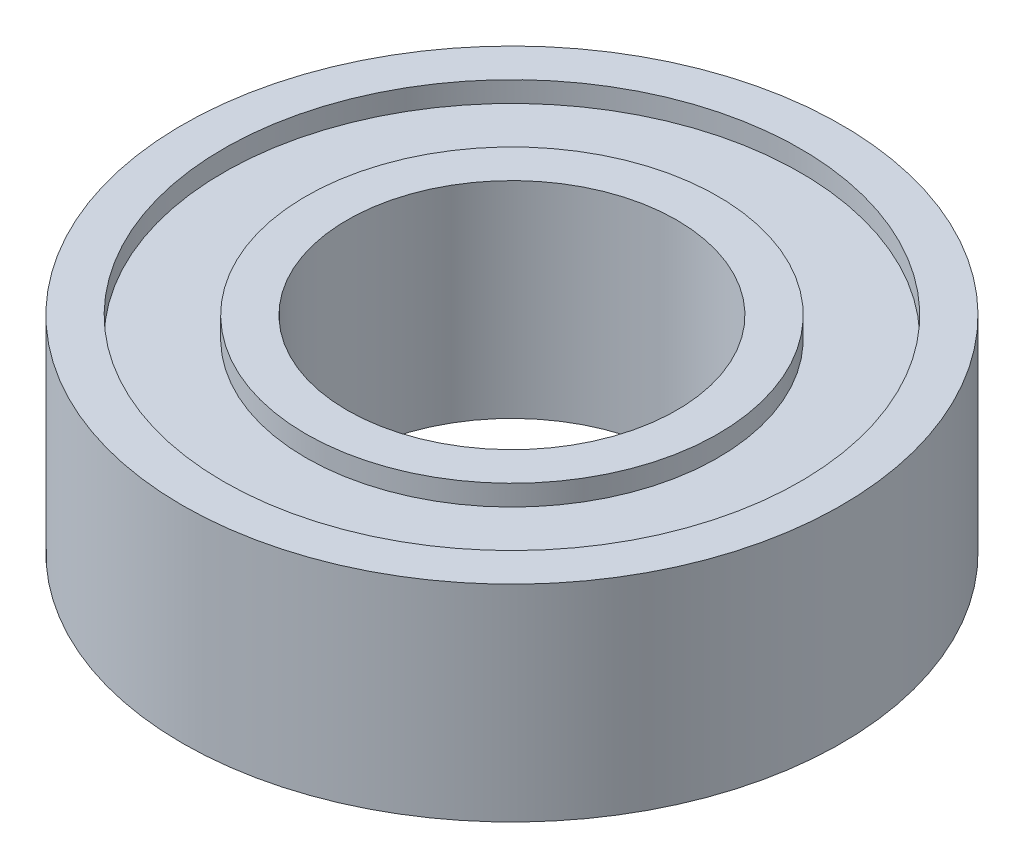
ISO-10303-21;
HEADER;
FILE_DESCRIPTION(('STEP AP214'),'2;1');
FILE_NAME('part.step','',(''),(''),'','','');
FILE_SCHEMA(('AUTOMOTIVE_DESIGN { 1 0 10303 214 1 1 1 1 }'));
ENDSEC;
DATA;
#1=APPLICATION_CONTEXT('core data for automotive mechanical design processes');
#2=APPLICATION_PROTOCOL_DEFINITION('international standard','automotive_design',2000,#1);
#3=PRODUCT_CONTEXT('',#1,'mechanical');
#4=PRODUCT('Part','Part','',(#3));
#5=PRODUCT_RELATED_PRODUCT_CATEGORY('part','',(#4));
#6=PRODUCT_DEFINITION_FORMATION('','',#4);
#7=PRODUCT_DEFINITION_CONTEXT('part definition',#1,'design');
#8=PRODUCT_DEFINITION('design','',#6,#7);
#9=PRODUCT_DEFINITION_SHAPE('','',#8);
#10=(LENGTH_UNIT() NAMED_UNIT(*) SI_UNIT(.MILLI.,.METRE.));
#11=(NAMED_UNIT(*) PLANE_ANGLE_UNIT() SI_UNIT($,.RADIAN.));
#12=(NAMED_UNIT(*) SI_UNIT($,.STERADIAN.) SOLID_ANGLE_UNIT());
#13=UNCERTAINTY_MEASURE_WITH_UNIT(LENGTH_MEASURE(1.E-05),#10,'distance_accuracy_value','');
#14=(GEOMETRIC_REPRESENTATION_CONTEXT(3) GLOBAL_UNCERTAINTY_ASSIGNED_CONTEXT((#13)) GLOBAL_UNIT_ASSIGNED_CONTEXT((#10,
#11,#12)) REPRESENTATION_CONTEXT('',''));
#15=CARTESIAN_POINT('',(0.,0.,0.));
#16=DIRECTION('',(0.,0.,1.));
#17=DIRECTION('',(1.,0.,0.));
#18=AXIS2_PLACEMENT_3D('',#15,#16,#17);
#19=CARTESIAN_POINT('',(0.,-2.5,0.));
#20=DIRECTION('',(0.,1.,0.));
#21=DIRECTION('',(0.,0.,1.));
#22=AXIS2_PLACEMENT_3D('',#19,#20,#21);
#23=PLANE('',#22);
#24=CARTESIAN_POINT('',(0.,-2.5,0.));
#25=DIRECTION('',(0.,1.,0.));
#26=DIRECTION('',(0.,0.,1.));
#27=AXIS2_PLACEMENT_3D('',#24,#25,#26);
#28=CIRCLE('',#27,4.);
#29=CARTESIAN_POINT('',(0.,-2.5,4.));
#30=VERTEX_POINT('',#29);
#31=EDGE_CURVE('E58',#30,#30,#28,.T.);
#32=ORIENTED_EDGE('',*,*,#31,.T.);
#33=EDGE_LOOP('',(#32));
#34=FACE_BOUND('',#33,.T.);
#35=CARTESIAN_POINT('',(0.,-2.5,0.));
#36=DIRECTION('',(0.,1.,0.));
#37=DIRECTION('',(0.,0.,1.));
#38=AXIS2_PLACEMENT_3D('',#35,#36,#37);
#39=CIRCLE('',#38,5.);
#40=CARTESIAN_POINT('',(0.,-2.5,5.));
#41=VERTEX_POINT('',#40);
#42=EDGE_CURVE('E82',#41,#41,#39,.T.);
#43=ORIENTED_EDGE('',*,*,#42,.F.);
#44=EDGE_LOOP('',(#43));
#45=FACE_BOUND('',#44,.T.);
#46=ADVANCED_FACE('F45',(#34,#45),#23,.F.);
#47=CARTESIAN_POINT('',(0.,2.5,0.));
#48=DIRECTION('',(0.,1.,0.));
#49=DIRECTION('',(0.,0.,1.));
#50=AXIS2_PLACEMENT_3D('',#47,#48,#49);
#51=PLANE('',#50);
#52=CARTESIAN_POINT('',(0.,2.5,0.));
#53=DIRECTION('',(0.,1.,0.));
#54=DIRECTION('',(0.,0.,1.));
#55=AXIS2_PLACEMENT_3D('',#52,#53,#54);
#56=CIRCLE('',#55,4.);
#57=CARTESIAN_POINT('',(0.,2.5,4.));
#58=VERTEX_POINT('',#57);
#59=EDGE_CURVE('E56',#58,#58,#56,.T.);
#60=ORIENTED_EDGE('',*,*,#59,.F.);
#61=EDGE_LOOP('',(#60));
#62=FACE_BOUND('',#61,.T.);
#63=CARTESIAN_POINT('',(0.,2.5,0.));
#64=DIRECTION('',(0.,1.,0.));
#65=DIRECTION('',(0.,0.,1.));
#66=AXIS2_PLACEMENT_3D('',#63,#64,#65);
#67=CIRCLE('',#66,5.);
#68=CARTESIAN_POINT('',(0.,2.5,5.));
#69=VERTEX_POINT('',#68);
#70=EDGE_CURVE('E70',#69,#69,#67,.T.);
#71=ORIENTED_EDGE('',*,*,#70,.T.);
#72=EDGE_LOOP('',(#71));
#73=FACE_BOUND('',#72,.T.);
#74=ADVANCED_FACE('F98',(#62,#73),#51,.T.);
#75=CARTESIAN_POINT('',(0.,2.5,0.));
#76=DIRECTION('',(0.,1.,0.));
#77=DIRECTION('',(0.,0.,1.));
#78=AXIS2_PLACEMENT_3D('',#75,#76,#77);
#79=CIRCLE('',#78,7.);
#80=CARTESIAN_POINT('',(0.,2.5,7.));
#81=VERTEX_POINT('',#80);
#82=EDGE_CURVE('E64',#81,#81,#79,.T.);
#83=ORIENTED_EDGE('',*,*,#82,.F.);
#84=EDGE_LOOP('',(#83));
#85=FACE_BOUND('',#84,.T.);
#86=CARTESIAN_POINT('',(0.,2.5,0.));
#87=DIRECTION('',(0.,1.,0.));
#88=DIRECTION('',(0.,0.,1.));
#89=AXIS2_PLACEMENT_3D('',#86,#87,#88);
#90=CIRCLE('',#89,8.);
#91=CARTESIAN_POINT('',(0.,2.5,8.));
#92=VERTEX_POINT('',#91);
#93=EDGE_CURVE('E10',#92,#92,#90,.T.);
#94=ORIENTED_EDGE('',*,*,#93,.T.);
#95=EDGE_LOOP('',(#94));
#96=FACE_BOUND('',#95,.T.);
#97=ADVANCED_FACE('F104',(#85,#96),#51,.T.);
#98=CARTESIAN_POINT('',(0.,-2.5,0.));
#99=DIRECTION('',(0.,1.,0.));
#100=DIRECTION('',(0.,0.,1.));
#101=AXIS2_PLACEMENT_3D('',#98,#99,#100);
#102=CIRCLE('',#101,7.);
#103=CARTESIAN_POINT('',(0.,-2.5,7.));
#104=VERTEX_POINT('',#103);
#105=EDGE_CURVE('E76',#104,#104,#102,.T.);
#106=ORIENTED_EDGE('',*,*,#105,.T.);
#107=EDGE_LOOP('',(#106));
#108=FACE_BOUND('',#107,.T.);
#109=CARTESIAN_POINT('',(0.,-2.5,0.));
#110=DIRECTION('',(0.,1.,0.));
#111=DIRECTION('',(0.,0.,1.));
#112=AXIS2_PLACEMENT_3D('',#109,#110,#111);
#113=CIRCLE('',#112,8.);
#114=CARTESIAN_POINT('',(0.,-2.5,8.));
#115=VERTEX_POINT('',#114);
#116=EDGE_CURVE('E49',#115,#115,#113,.T.);
#117=ORIENTED_EDGE('',*,*,#116,.F.);
#118=EDGE_LOOP('',(#117));
#119=FACE_BOUND('',#118,.T.);
#120=ADVANCED_FACE('F100',(#108,#119),#23,.F.);
#121=CARTESIAN_POINT('',(0.,2.5,0.));
#122=DIRECTION('',(0.,-1.,0.));
#123=DIRECTION('',(0.,0.,-1.));
#124=AXIS2_PLACEMENT_3D('',#121,#122,#123);
#125=CYLINDRICAL_SURFACE('',#124,8.);
#126=ORIENTED_EDGE('',*,*,#93,.F.);
#127=EDGE_LOOP('',(#126));
#128=FACE_BOUND('',#127,.T.);
#129=ORIENTED_EDGE('',*,*,#116,.T.);
#130=EDGE_LOOP('',(#129));
#131=FACE_BOUND('',#130,.T.);
#132=ADVANCED_FACE('F47',(#128,#131),#125,.T.);
#133=CARTESIAN_POINT('',(0.,2.5,0.));
#134=DIRECTION('',(0.,-1.,0.));
#135=DIRECTION('',(0.,0.,-1.));
#136=AXIS2_PLACEMENT_3D('',#133,#134,#135);
#137=CYLINDRICAL_SURFACE('',#136,4.);
#138=ORIENTED_EDGE('',*,*,#59,.T.);
#139=EDGE_LOOP('',(#138));
#140=FACE_BOUND('',#139,.T.);
#141=ORIENTED_EDGE('',*,*,#31,.F.);
#142=EDGE_LOOP('',(#141));
#143=FACE_BOUND('',#142,.T.);
#144=ADVANCED_FACE('F113',(#140,#143),#137,.F.);
#145=CARTESIAN_POINT('',(0.,2.,0.));
#146=DIRECTION('',(0.,1.,0.));
#147=DIRECTION('',(0.,0.,1.));
#148=AXIS2_PLACEMENT_3D('',#145,#146,#147);
#149=CYLINDRICAL_SURFACE('',#148,7.);
#150=CARTESIAN_POINT('',(0.,2.,0.));
#151=DIRECTION('',(0.,1.,0.));
#152=DIRECTION('',(0.,0.,1.));
#153=AXIS2_PLACEMENT_3D('',#150,#151,#152);
#154=CIRCLE('',#153,7.);
#155=CARTESIAN_POINT('',(0.,2.,7.));
#156=VERTEX_POINT('',#155);
#157=EDGE_CURVE('E61',#156,#156,#154,.T.);
#158=ORIENTED_EDGE('',*,*,#157,.F.);
#159=EDGE_LOOP('',(#158));
#160=FACE_BOUND('',#159,.T.);
#161=ORIENTED_EDGE('',*,*,#82,.T.);
#162=EDGE_LOOP('',(#161));
#163=FACE_BOUND('',#162,.T.);
#164=ADVANCED_FACE('F137',(#160,#163),#149,.F.);
#165=CARTESIAN_POINT('',(0.,2.,0.));
#166=DIRECTION('',(0.,1.,0.));
#167=DIRECTION('',(0.,0.,1.));
#168=AXIS2_PLACEMENT_3D('',#165,#166,#167);
#169=PLANE('',#168);
#170=CARTESIAN_POINT('',(0.,2.,0.));
#171=DIRECTION('',(0.,1.,0.));
#172=DIRECTION('',(0.,0.,1.));
#173=AXIS2_PLACEMENT_3D('',#170,#171,#172);
#174=CIRCLE('',#173,5.);
#175=CARTESIAN_POINT('',(0.,2.,5.));
#176=VERTEX_POINT('',#175);
#177=EDGE_CURVE('E67',#176,#176,#174,.T.);
#178=ORIENTED_EDGE('',*,*,#177,.F.);
#179=EDGE_LOOP('',(#178));
#180=FACE_BOUND('',#179,.T.);
#181=ORIENTED_EDGE('',*,*,#157,.T.);
#182=EDGE_LOOP('',(#181));
#183=FACE_BOUND('',#182,.T.);
#184=ADVANCED_FACE('F133',(#180,#183),#169,.T.);
#185=CARTESIAN_POINT('',(0.,2.,0.));
#186=DIRECTION('',(0.,1.,0.));
#187=DIRECTION('',(0.,0.,1.));
#188=AXIS2_PLACEMENT_3D('',#185,#186,#187);
#189=CYLINDRICAL_SURFACE('',#188,5.);
#190=ORIENTED_EDGE('',*,*,#177,.T.);
#191=EDGE_LOOP('',(#190));
#192=FACE_BOUND('',#191,.T.);
#193=ORIENTED_EDGE('',*,*,#70,.F.);
#194=EDGE_LOOP('',(#193));
#195=FACE_BOUND('',#194,.T.);
#196=ADVANCED_FACE('F127',(#192,#195),#189,.T.);
#197=CARTESIAN_POINT('',(0.,-2.,0.));
#198=DIRECTION('',(0.,-1.,0.));
#199=DIRECTION('',(0.,0.,1.));
#200=AXIS2_PLACEMENT_3D('',#197,#198,#199);
#201=PLANE('',#200);
#202=CARTESIAN_POINT('',(0.,-2.,0.));
#203=DIRECTION('',(0.,1.,0.));
#204=DIRECTION('',(0.,0.,1.));
#205=AXIS2_PLACEMENT_3D('',#202,#203,#204);
#206=CIRCLE('',#205,7.);
#207=CARTESIAN_POINT('',(0.,-2.,7.));
#208=VERTEX_POINT('',#207);
#209=EDGE_CURVE('E73',#208,#208,#206,.T.);
#210=ORIENTED_EDGE('',*,*,#209,.F.);
#211=EDGE_LOOP('',(#210));
#212=FACE_BOUND('',#211,.T.);
#213=CARTESIAN_POINT('',(0.,-2.,0.));
#214=DIRECTION('',(0.,1.,0.));
#215=DIRECTION('',(0.,0.,1.));
#216=AXIS2_PLACEMENT_3D('',#213,#214,#215);
#217=CIRCLE('',#216,5.);
#218=CARTESIAN_POINT('',(0.,-2.,5.));
#219=VERTEX_POINT('',#218);
#220=EDGE_CURVE('E79',#219,#219,#217,.T.);
#221=ORIENTED_EDGE('',*,*,#220,.T.);
#222=EDGE_LOOP('',(#221));
#223=FACE_BOUND('',#222,.T.);
#224=ADVANCED_FACE('F88',(#212,#223),#201,.T.);
#225=CARTESIAN_POINT('',(0.,-2.,0.));
#226=DIRECTION('',(0.,-1.,0.));
#227=DIRECTION('',(0.,0.,-1.));
#228=AXIS2_PLACEMENT_3D('',#225,#226,#227);
#229=CYLINDRICAL_SURFACE('',#228,7.);
#230=ORIENTED_EDGE('',*,*,#209,.T.);
#231=EDGE_LOOP('',(#230));
#232=FACE_BOUND('',#231,.T.);
#233=ORIENTED_EDGE('',*,*,#105,.F.);
#234=EDGE_LOOP('',(#233));
#235=FACE_BOUND('',#234,.T.);
#236=ADVANCED_FACE('F93',(#232,#235),#229,.F.);
#237=CARTESIAN_POINT('',(0.,-2.,0.));
#238=DIRECTION('',(0.,-1.,0.));
#239=DIRECTION('',(0.,0.,-1.));
#240=AXIS2_PLACEMENT_3D('',#237,#238,#239);
#241=CYLINDRICAL_SURFACE('',#240,5.);
#242=ORIENTED_EDGE('',*,*,#220,.F.);
#243=EDGE_LOOP('',(#242));
#244=FACE_BOUND('',#243,.T.);
#245=ORIENTED_EDGE('',*,*,#42,.T.);
#246=EDGE_LOOP('',(#245));
#247=FACE_BOUND('',#246,.T.);
#248=ADVANCED_FACE('F90',(#244,#247),#241,.T.);
#249=CLOSED_SHELL('',(#46,#74,#97,#120,#132,#144,#164,#184,#196,#224,#236,#248));
#250=MANIFOLD_SOLID_BREP('B2',#249);
#251=ADVANCED_BREP_SHAPE_REPRESENTATION('',(#18,#250),#14);
#252=SHAPE_DEFINITION_REPRESENTATION(#9,#251);
ENDSEC;
END-ISO-10303-21;
